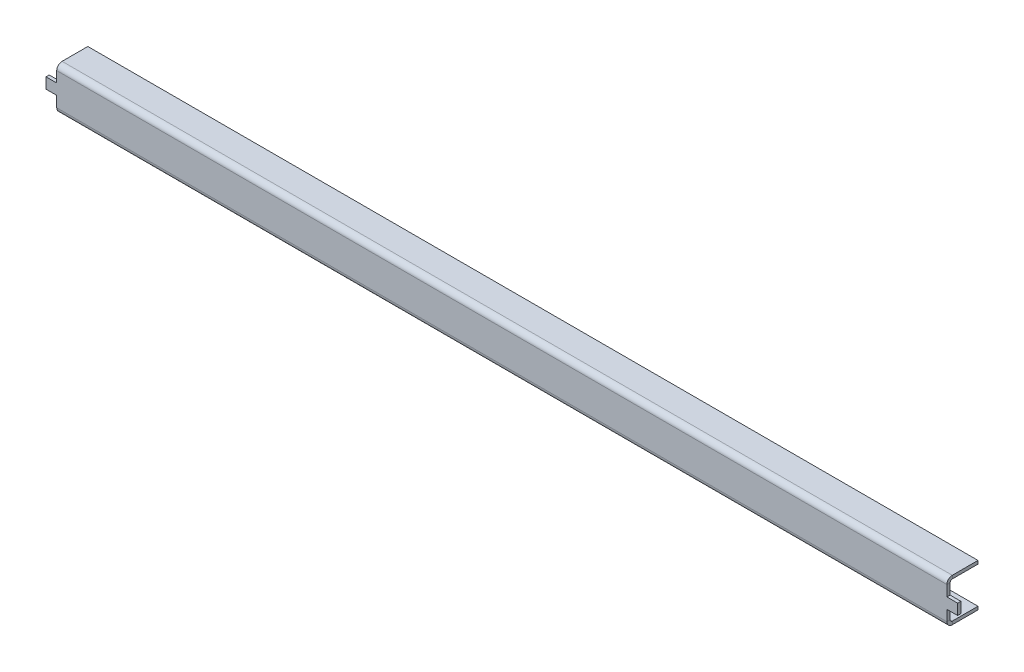
ISO-10303-21;
HEADER;
FILE_DESCRIPTION(('STEP AP214'),'2;1');
FILE_NAME('part.step','',(''),(''),'','','');
FILE_SCHEMA(('AUTOMOTIVE_DESIGN { 1 0 10303 214 1 1 1 1 }'));
ENDSEC;
DATA;
#1=APPLICATION_CONTEXT('core data for automotive mechanical design processes');
#2=APPLICATION_PROTOCOL_DEFINITION('international standard','automotive_design',2000,#1);
#3=PRODUCT_CONTEXT('',#1,'mechanical');
#4=PRODUCT('Part','Part','',(#3));
#5=PRODUCT_RELATED_PRODUCT_CATEGORY('part','',(#4));
#6=PRODUCT_DEFINITION_FORMATION('','',#4);
#7=PRODUCT_DEFINITION_CONTEXT('part definition',#1,'design');
#8=PRODUCT_DEFINITION('design','',#6,#7);
#9=PRODUCT_DEFINITION_SHAPE('','',#8);
#10=(LENGTH_UNIT() NAMED_UNIT(*) SI_UNIT(.MILLI.,.METRE.));
#11=(NAMED_UNIT(*) PLANE_ANGLE_UNIT() SI_UNIT($,.RADIAN.));
#12=(NAMED_UNIT(*) SI_UNIT($,.STERADIAN.) SOLID_ANGLE_UNIT());
#13=UNCERTAINTY_MEASURE_WITH_UNIT(LENGTH_MEASURE(1.E-05),#10,'distance_accuracy_value','');
#14=(GEOMETRIC_REPRESENTATION_CONTEXT(3) GLOBAL_UNCERTAINTY_ASSIGNED_CONTEXT((#13)) GLOBAL_UNIT_ASSIGNED_CONTEXT((#10,
#11,#12)) REPRESENTATION_CONTEXT('',''));
#15=CARTESIAN_POINT('',(0.,0.,0.));
#16=DIRECTION('',(0.,0.,1.));
#17=DIRECTION('',(1.,0.,0.));
#18=AXIS2_PLACEMENT_3D('',#15,#16,#17);
#19=CARTESIAN_POINT('',(207.5,487.846915451609,3.1641356201817E-12));
#20=DIRECTION('',(0.,0.,1.));
#21=DIRECTION('',(0.,-1.,0.));
#22=AXIS2_PLACEMENT_3D('',#19,#20,#21);
#23=PLANE('',#22);
#24=DIRECTION('',(0.,-1.,0.));
#25=VECTOR('',#24,1.);
#26=CARTESIAN_POINT('',(207.5,487.846915451609,3.1641356201817E-12));
#27=LINE('',#26,#25);
#28=CARTESIAN_POINT('',(207.5,-342.5,0.));
#29=VERTEX_POINT('',#28);
#30=CARTESIAN_POINT('',(207.5,-344.,0.));
#31=VERTEX_POINT('',#30);
#32=EDGE_CURVE('E286',#29,#31,#27,.T.);
#33=ORIENTED_EDGE('',*,*,#32,.T.);
#34=DIRECTION('',(1.,0.,0.));
#35=VECTOR('',#34,1.);
#36=CARTESIAN_POINT('',(207.5,-344.,0.));
#37=LINE('',#36,#35);
#38=CARTESIAN_POINT('',(-207.5,-344.,0.));
#39=VERTEX_POINT('',#38);
#40=EDGE_CURVE('E77',#31,#39,#37,.F.);
#41=ORIENTED_EDGE('',*,*,#40,.T.);
#42=DIRECTION('',(0.,-1.,0.));
#43=VECTOR('',#42,1.);
#44=CARTESIAN_POINT('',(-207.5,487.846915451609,3.1641356201817E-12));
#45=LINE('',#44,#43);
#46=CARTESIAN_POINT('',(-207.5,-342.5,0.));
#47=VERTEX_POINT('',#46);
#48=EDGE_CURVE('E499',#47,#39,#45,.T.);
#49=ORIENTED_EDGE('',*,*,#48,.F.);
#50=DIRECTION('',(1.,0.,0.));
#51=VECTOR('',#50,1.);
#52=CARTESIAN_POINT('',(207.5,-342.5,0.));
#53=LINE('',#52,#51);
#54=EDGE_CURVE('E12',#29,#47,#53,.F.);
#55=ORIENTED_EDGE('',*,*,#54,.F.);
#56=EDGE_LOOP('',(#33,#41,#49,#55));
#57=FACE_BOUND('',#56,.T.);
#58=ADVANCED_FACE('F53',(#57),#23,.F.);
#59=CARTESIAN_POINT('',(207.5,487.846915451609,12.0000000000032));
#60=DIRECTION('',(1.,0.,0.));
#61=DIRECTION('',(0.,1.,0.));
#62=AXIS2_PLACEMENT_3D('',#59,#60,#61);
#63=PLANE('',#62);
#64=DIRECTION('',(0.,0.,-1.));
#65=VECTOR('',#64,1.);
#66=CARTESIAN_POINT('',(207.5,-344.,12.));
#67=LINE('',#66,#65);
#68=CARTESIAN_POINT('',(207.5,-344.,11.9999999999999));
#69=VERTEX_POINT('',#68);
#70=EDGE_CURVE('E263',#69,#31,#67,.T.);
#71=ORIENTED_EDGE('',*,*,#70,.T.);
#72=ORIENTED_EDGE('',*,*,#32,.F.);
#73=DIRECTION('',(0.,0.,-1.));
#74=VECTOR('',#73,1.);
#75=CARTESIAN_POINT('',(207.5,-342.5,12.));
#76=LINE('',#75,#74);
#77=CARTESIAN_POINT('',(207.5,-342.5,12.));
#78=VERTEX_POINT('',#77);
#79=EDGE_CURVE('E111',#29,#78,#76,.F.);
#80=ORIENTED_EDGE('',*,*,#79,.T.);
#81=DIRECTION('',(0.,-1.,0.));
#82=VECTOR('',#81,1.);
#83=CARTESIAN_POINT('',(207.5,487.846915451609,12.0000000000032));
#84=LINE('',#83,#82);
#85=EDGE_CURVE('E261',#78,#69,#84,.T.);
#86=ORIENTED_EDGE('',*,*,#85,.T.);
#87=EDGE_LOOP('',(#71,#72,#80,#86));
#88=FACE_BOUND('',#87,.T.);
#89=ADVANCED_FACE('F262',(#88),#63,.T.);
#90=CARTESIAN_POINT('',(207.5,-344.,0.));
#91=DIRECTION('',(0.,1.,0.));
#92=DIRECTION('',(0.,0.,1.));
#93=AXIS2_PLACEMENT_3D('',#90,#91,#92);
#94=PLANE('',#93);
#95=DIRECTION('',(0.,0.,1.));
#96=VECTOR('',#95,1.);
#97=CARTESIAN_POINT('',(-207.5,-344.,12.));
#98=LINE('',#97,#96);
#99=CARTESIAN_POINT('',(-207.5,-344.,12.));
#100=VERTEX_POINT('',#99);
#101=EDGE_CURVE('E269',#39,#100,#98,.T.);
#102=ORIENTED_EDGE('',*,*,#101,.F.);
#103=ORIENTED_EDGE('',*,*,#40,.F.);
#104=ORIENTED_EDGE('',*,*,#70,.F.);
#105=DIRECTION('',(-1.,0.,0.));
#106=VECTOR('',#105,1.);
#107=CARTESIAN_POINT('',(207.5,-344.,12.));
#108=LINE('',#107,#106);
#109=EDGE_CURVE('E274',#100,#69,#108,.F.);
#110=ORIENTED_EDGE('',*,*,#109,.F.);
#111=EDGE_LOOP('',(#102,#103,#104,#110));
#112=FACE_BOUND('',#111,.T.);
#113=ADVANCED_FACE('F273',(#112),#94,.F.);
#114=CARTESIAN_POINT('',(-207.5,487.846915451609,12.0000000000032));
#115=DIRECTION('',(-1.,0.,0.));
#116=DIRECTION('',(0.,-1.,0.));
#117=AXIS2_PLACEMENT_3D('',#114,#115,#116);
#118=PLANE('',#117);
#119=ORIENTED_EDGE('',*,*,#101,.T.);
#120=DIRECTION('',(0.,-1.,0.));
#121=VECTOR('',#120,1.);
#122=CARTESIAN_POINT('',(-207.5,487.846915451609,12.0000000000032));
#123=LINE('',#122,#121);
#124=CARTESIAN_POINT('',(-207.5,-342.5,12.));
#125=VERTEX_POINT('',#124);
#126=EDGE_CURVE('E58',#125,#100,#123,.T.);
#127=ORIENTED_EDGE('',*,*,#126,.F.);
#128=DIRECTION('',(0.,0.,1.));
#129=VECTOR('',#128,1.);
#130=CARTESIAN_POINT('',(-207.5,-342.5,12.));
#131=LINE('',#130,#129);
#132=EDGE_CURVE('E482',#125,#47,#131,.F.);
#133=ORIENTED_EDGE('',*,*,#132,.T.);
#134=ORIENTED_EDGE('',*,*,#48,.T.);
#135=EDGE_LOOP('',(#119,#127,#133,#134));
#136=FACE_BOUND('',#135,.T.);
#137=ADVANCED_FACE('F592',(#136),#118,.T.);
#138=CARTESIAN_POINT('',(207.5,-342.5,0.));
#139=DIRECTION('',(0.,1.,0.));
#140=DIRECTION('',(0.,0.,1.));
#141=AXIS2_PLACEMENT_3D('',#138,#139,#140);
#142=PLANE('',#141);
#143=ORIENTED_EDGE('',*,*,#132,.F.);
#144=DIRECTION('',(-1.,0.,0.));
#145=VECTOR('',#144,1.);
#146=CARTESIAN_POINT('',(207.5,-342.5,12.));
#147=LINE('',#146,#145);
#148=EDGE_CURVE('E65',#125,#78,#147,.F.);
#149=ORIENTED_EDGE('',*,*,#148,.T.);
#150=ORIENTED_EDGE('',*,*,#79,.F.);
#151=ORIENTED_EDGE('',*,*,#54,.T.);
#152=EDGE_LOOP('',(#143,#149,#150,#151));
#153=FACE_BOUND('',#152,.T.);
#154=ADVANCED_FACE('F56',(#153),#142,.T.);
#155=CARTESIAN_POINT('',(207.5,-1155.84691545161,3.21964677141295E-12));
#156=DIRECTION('',(0.,0.,1.));
#157=DIRECTION('',(0.,-1.,0.));
#158=AXIS2_PLACEMENT_3D('',#155,#156,#157);
#159=PLANE('',#158);
#160=DIRECTION('',(0.,1.,0.));
#161=VECTOR('',#160,1.);
#162=CARTESIAN_POINT('',(-207.5,-1155.84691545161,3.21964677141295E-12));
#163=LINE('',#162,#161);
#164=CARTESIAN_POINT('',(-207.5,-325.5,0.));
#165=VERTEX_POINT('',#164);
#166=CARTESIAN_POINT('',(-207.5,-324.,0.));
#167=VERTEX_POINT('',#166);
#168=EDGE_CURVE('E474',#165,#167,#163,.T.);
#169=ORIENTED_EDGE('',*,*,#168,.T.);
#170=DIRECTION('',(1.,0.,0.));
#171=VECTOR('',#170,1.);
#172=CARTESIAN_POINT('',(207.5,-324.,0.));
#173=LINE('',#172,#171);
#174=CARTESIAN_POINT('',(207.5,-324.,0.));
#175=VERTEX_POINT('',#174);
#176=EDGE_CURVE('E469',#167,#175,#173,.T.);
#177=ORIENTED_EDGE('',*,*,#176,.T.);
#178=DIRECTION('',(0.,1.,0.));
#179=VECTOR('',#178,1.);
#180=CARTESIAN_POINT('',(207.5,-1155.84691545161,3.21964677141295E-12));
#181=LINE('',#180,#179);
#182=CARTESIAN_POINT('',(207.5,-325.5,0.));
#183=VERTEX_POINT('',#182);
#184=EDGE_CURVE('E448',#183,#175,#181,.T.);
#185=ORIENTED_EDGE('',*,*,#184,.F.);
#186=DIRECTION('',(1.,0.,0.));
#187=VECTOR('',#186,1.);
#188=CARTESIAN_POINT('',(207.5,-325.5,0.));
#189=LINE('',#188,#187);
#190=EDGE_CURVE('E443',#165,#183,#189,.T.);
#191=ORIENTED_EDGE('',*,*,#190,.F.);
#192=EDGE_LOOP('',(#169,#177,#185,#191));
#193=FACE_BOUND('',#192,.T.);
#194=ADVANCED_FACE('F516',(#193),#159,.F.);
#195=CARTESIAN_POINT('',(-207.5,-1155.84691545161,12.0000000000032));
#196=DIRECTION('',(-1.,0.,0.));
#197=DIRECTION('',(0.,1.,0.));
#198=AXIS2_PLACEMENT_3D('',#195,#196,#197);
#199=PLANE('',#198);
#200=DIRECTION('',(0.,0.,1.));
#201=VECTOR('',#200,1.);
#202=CARTESIAN_POINT('',(-207.5,-324.,12.));
#203=LINE('',#202,#201);
#204=CARTESIAN_POINT('',(-207.5,-324.,12.));
#205=VERTEX_POINT('',#204);
#206=EDGE_CURVE('E465',#205,#167,#203,.F.);
#207=ORIENTED_EDGE('',*,*,#206,.T.);
#208=ORIENTED_EDGE('',*,*,#168,.F.);
#209=DIRECTION('',(0.,0.,1.));
#210=VECTOR('',#209,1.);
#211=CARTESIAN_POINT('',(-207.5,-325.5,12.));
#212=LINE('',#211,#210);
#213=CARTESIAN_POINT('',(-207.5,-325.5,12.0000000000001));
#214=VERTEX_POINT('',#213);
#215=EDGE_CURVE('E153',#165,#214,#212,.T.);
#216=ORIENTED_EDGE('',*,*,#215,.T.);
#217=DIRECTION('',(0.,1.,0.));
#218=VECTOR('',#217,1.);
#219=CARTESIAN_POINT('',(-207.5,-1155.84691545161,12.0000000000033));
#220=LINE('',#219,#218);
#221=EDGE_CURVE('E460',#214,#205,#220,.T.);
#222=ORIENTED_EDGE('',*,*,#221,.T.);
#223=EDGE_LOOP('',(#207,#208,#216,#222));
#224=FACE_BOUND('',#223,.T.);
#225=ADVANCED_FACE('F517',(#224),#199,.T.);
#226=CARTESIAN_POINT('',(207.5,-324.,14.5000000000001));
#227=DIRECTION('',(0.,-1.,0.));
#228=DIRECTION('',(0.,0.,-1.));
#229=AXIS2_PLACEMENT_3D('',#226,#227,#228);
#230=PLANE('',#229);
#231=ORIENTED_EDGE('',*,*,#206,.F.);
#232=DIRECTION('',(-1.,0.,0.));
#233=VECTOR('',#232,1.);
#234=CARTESIAN_POINT('',(207.5,-324.,12.0000000000001));
#235=LINE('',#234,#233);
#236=CARTESIAN_POINT('',(207.5,-324.,12.0000000000001));
#237=VERTEX_POINT('',#236);
#238=EDGE_CURVE('E504',#237,#205,#235,.T.);
#239=ORIENTED_EDGE('',*,*,#238,.F.);
#240=DIRECTION('',(0.,0.,-1.));
#241=VECTOR('',#240,1.);
#242=CARTESIAN_POINT('',(207.5,-324.,12.0000000000001));
#243=LINE('',#242,#241);
#244=EDGE_CURVE('E457',#175,#237,#243,.F.);
#245=ORIENTED_EDGE('',*,*,#244,.F.);
#246=ORIENTED_EDGE('',*,*,#176,.F.);
#247=EDGE_LOOP('',(#231,#239,#245,#246));
#248=FACE_BOUND('',#247,.T.);
#249=ADVANCED_FACE('F612',(#248),#230,.F.);
#250=CARTESIAN_POINT('',(207.5,-1155.84691545161,12.0000000000032));
#251=DIRECTION('',(1.,0.,0.));
#252=DIRECTION('',(0.,-1.,0.));
#253=AXIS2_PLACEMENT_3D('',#250,#251,#252);
#254=PLANE('',#253);
#255=ORIENTED_EDGE('',*,*,#244,.T.);
#256=DIRECTION('',(0.,1.,0.));
#257=VECTOR('',#256,1.);
#258=CARTESIAN_POINT('',(207.5,-1155.84691545161,12.0000000000033));
#259=LINE('',#258,#257);
#260=CARTESIAN_POINT('',(207.5,-325.5,12.0000000000001));
#261=VERTEX_POINT('',#260);
#262=EDGE_CURVE('E146',#261,#237,#259,.T.);
#263=ORIENTED_EDGE('',*,*,#262,.F.);
#264=DIRECTION('',(0.,0.,-1.));
#265=VECTOR('',#264,1.);
#266=CARTESIAN_POINT('',(207.5,-325.5,12.));
#267=LINE('',#266,#265);
#268=EDGE_CURVE('E120',#261,#183,#267,.T.);
#269=ORIENTED_EDGE('',*,*,#268,.T.);
#270=ORIENTED_EDGE('',*,*,#184,.T.);
#271=EDGE_LOOP('',(#255,#263,#269,#270));
#272=FACE_BOUND('',#271,.T.);
#273=ADVANCED_FACE('F696',(#272),#254,.T.);
#274=CARTESIAN_POINT('',(207.5,-325.5,14.5000000000001));
#275=DIRECTION('',(0.,-1.,0.));
#276=DIRECTION('',(0.,0.,-1.));
#277=AXIS2_PLACEMENT_3D('',#274,#275,#276);
#278=PLANE('',#277);
#279=ORIENTED_EDGE('',*,*,#215,.F.);
#280=ORIENTED_EDGE('',*,*,#190,.T.);
#281=ORIENTED_EDGE('',*,*,#268,.F.);
#282=DIRECTION('',(-1.,0.,0.));
#283=VECTOR('',#282,1.);
#284=CARTESIAN_POINT('',(207.5,-325.5,12.0000000000001));
#285=LINE('',#284,#283);
#286=EDGE_CURVE('E439',#261,#214,#285,.T.);
#287=ORIENTED_EDGE('',*,*,#286,.T.);
#288=EDGE_LOOP('',(#279,#280,#281,#287));
#289=FACE_BOUND('',#288,.T.);
#290=ADVANCED_FACE('F520',(#289),#278,.T.);
#291=CARTESIAN_POINT('',(207.5,-344.,14.5));
#292=DIRECTION('',(0.,0.,-1.));
#293=DIRECTION('',(0.,1.,0.));
#294=AXIS2_PLACEMENT_3D('',#291,#292,#293);
#295=PLANE('',#294);
#296=DIRECTION('',(0.,1.,0.));
#297=VECTOR('',#296,1.);
#298=CARTESIAN_POINT('',(-207.5,-342.5,14.5));
#299=LINE('',#298,#297);
#300=CARTESIAN_POINT('',(-207.5,-341.5,14.5));
#301=VERTEX_POINT('',#300);
#302=CARTESIAN_POINT('',(-207.5,-336.5,14.5000000000003));
#303=VERTEX_POINT('',#302);
#304=EDGE_CURVE('E322',#301,#303,#299,.T.);
#305=ORIENTED_EDGE('',*,*,#304,.F.);
#306=DIRECTION('',(1.,0.,0.));
#307=VECTOR('',#306,1.);
#308=CARTESIAN_POINT('',(207.5,-341.5,14.5));
#309=LINE('',#308,#307);
#310=CARTESIAN_POINT('',(207.5,-341.5,14.5));
#311=VERTEX_POINT('',#310);
#312=EDGE_CURVE('E327',#311,#301,#309,.F.);
#313=ORIENTED_EDGE('',*,*,#312,.F.);
#314=DIRECTION('',(0.,1.,0.));
#315=VECTOR('',#314,1.);
#316=CARTESIAN_POINT('',(207.5,-325.5,14.5));
#317=LINE('',#316,#315);
#318=CARTESIAN_POINT('',(207.5,-336.5,14.5));
#319=VERTEX_POINT('',#318);
#320=EDGE_CURVE('E570',#319,#311,#317,.F.);
#321=ORIENTED_EDGE('',*,*,#320,.F.);
#322=DIRECTION('',(1.,0.,0.));
#323=VECTOR('',#322,1.);
#324=CARTESIAN_POINT('',(207.5,-336.5,14.5000000000003));
#325=LINE('',#324,#323);
#326=CARTESIAN_POINT('',(212.5,-336.5,14.5000000000003));
#327=VERTEX_POINT('',#326);
#328=EDGE_CURVE('E578',#319,#327,#325,.T.);
#329=ORIENTED_EDGE('',*,*,#328,.T.);
#330=DIRECTION('',(0.,1.,0.));
#331=VECTOR('',#330,1.);
#332=CARTESIAN_POINT('',(212.5,-336.5,14.5000000000003));
#333=LINE('',#332,#331);
#334=CARTESIAN_POINT('',(212.5,-331.5,14.5000000000003));
#335=VERTEX_POINT('',#334);
#336=EDGE_CURVE('E574',#327,#335,#333,.T.);
#337=ORIENTED_EDGE('',*,*,#336,.T.);
#338=DIRECTION('',(-1.,0.,0.));
#339=VECTOR('',#338,1.);
#340=CARTESIAN_POINT('',(207.5,-331.5,14.5000000000003));
#341=LINE('',#340,#339);
#342=CARTESIAN_POINT('',(207.5,-331.5,14.5000000000003));
#343=VERTEX_POINT('',#342);
#344=EDGE_CURVE('E569',#335,#343,#341,.T.);
#345=ORIENTED_EDGE('',*,*,#344,.T.);
#346=CARTESIAN_POINT('',(207.5,-326.5,14.5));
#347=VERTEX_POINT('',#346);
#348=EDGE_CURVE('E565',#347,#343,#317,.F.);
#349=ORIENTED_EDGE('',*,*,#348,.F.);
#350=DIRECTION('',(-1.,0.,0.));
#351=VECTOR('',#350,1.);
#352=CARTESIAN_POINT('',(207.5,-326.5,14.5));
#353=LINE('',#352,#351);
#354=CARTESIAN_POINT('',(-207.5,-326.5,14.5));
#355=VERTEX_POINT('',#354);
#356=EDGE_CURVE('E348',#355,#347,#353,.F.);
#357=ORIENTED_EDGE('',*,*,#356,.F.);
#358=CARTESIAN_POINT('',(-207.5,-331.5,14.5));
#359=VERTEX_POINT('',#358);
#360=EDGE_CURVE('E328',#359,#355,#299,.T.);
#361=ORIENTED_EDGE('',*,*,#360,.F.);
#362=DIRECTION('',(-1.,0.,0.));
#363=VECTOR('',#362,1.);
#364=CARTESIAN_POINT('',(-207.5,-331.5,14.5000000000003));
#365=LINE('',#364,#363);
#366=CARTESIAN_POINT('',(-212.5,-331.5,14.5000000000003));
#367=VERTEX_POINT('',#366);
#368=EDGE_CURVE('E343',#359,#367,#365,.T.);
#369=ORIENTED_EDGE('',*,*,#368,.T.);
#370=DIRECTION('',(0.,-1.,0.));
#371=VECTOR('',#370,1.);
#372=CARTESIAN_POINT('',(-212.5,-331.5,14.5000000000003));
#373=LINE('',#372,#371);
#374=CARTESIAN_POINT('',(-212.5,-336.5,14.5000000000003));
#375=VERTEX_POINT('',#374);
#376=EDGE_CURVE('E347',#367,#375,#373,.T.);
#377=ORIENTED_EDGE('',*,*,#376,.T.);
#378=DIRECTION('',(1.,0.,0.));
#379=VECTOR('',#378,1.);
#380=CARTESIAN_POINT('',(-207.5,-336.5,14.5000000000003));
#381=LINE('',#380,#379);
#382=EDGE_CURVE('E352',#375,#303,#381,.T.);
#383=ORIENTED_EDGE('',*,*,#382,.T.);
#384=EDGE_LOOP('',(#305,#313,#321,#329,#337,#345,#349,#357,#361,#369,#377,#383));
#385=FACE_BOUND('',#384,.T.);
#386=ADVANCED_FACE('F560',(#385),#295,.F.);
#387=CARTESIAN_POINT('',(-207.5,-343.999999999999,-837.529246998597));
#388=DIRECTION('',(1.,0.,0.));
#389=DIRECTION('',(0.,0.,-1.));
#390=AXIS2_PLACEMENT_3D('',#387,#388,#389);
#391=PLANE('',#390);
#392=DIRECTION('',(0.,0.,1.));
#393=VECTOR('',#392,1.);
#394=CARTESIAN_POINT('',(-207.5,-341.499999999999,-837.529246998597));
#395=LINE('',#394,#393);
#396=CARTESIAN_POINT('',(-207.5,-341.5,13.));
#397=VERTEX_POINT('',#396);
#398=EDGE_CURVE('E397',#397,#301,#395,.T.);
#399=ORIENTED_EDGE('',*,*,#398,.T.);
#400=ORIENTED_EDGE('',*,*,#304,.T.);
#401=DIRECTION('',(0.,0.,1.));
#402=VECTOR('',#401,1.);
#403=CARTESIAN_POINT('',(-207.5,-336.499999999999,-837.529246998597));
#404=LINE('',#403,#402);
#405=CARTESIAN_POINT('',(-207.5,-336.5,13.));
#406=VERTEX_POINT('',#405);
#407=EDGE_CURVE('E437',#406,#303,#404,.T.);
#408=ORIENTED_EDGE('',*,*,#407,.F.);
#409=DIRECTION('',(0.,1.,0.));
#410=VECTOR('',#409,1.);
#411=CARTESIAN_POINT('',(-207.5,-344.,13.));
#412=LINE('',#411,#410);
#413=EDGE_CURVE('E356',#397,#406,#412,.T.);
#414=ORIENTED_EDGE('',*,*,#413,.F.);
#415=EDGE_LOOP('',(#399,#400,#408,#414));
#416=FACE_BOUND('',#415,.T.);
#417=ADVANCED_FACE('F550',(#416),#391,.F.);
#418=CARTESIAN_POINT('',(-207.5,-336.499999999999,-837.529246998597));
#419=DIRECTION('',(0.,-1.,0.));
#420=DIRECTION('',(0.,0.,-1.));
#421=AXIS2_PLACEMENT_3D('',#418,#419,#420);
#422=PLANE('',#421);
#423=ORIENTED_EDGE('',*,*,#382,.F.);
#424=DIRECTION('',(0.,0.,1.));
#425=VECTOR('',#424,1.);
#426=CARTESIAN_POINT('',(-212.5,-336.499999999999,-837.529246998597));
#427=LINE('',#426,#425);
#428=CARTESIAN_POINT('',(-212.5,-336.5,13.));
#429=VERTEX_POINT('',#428);
#430=EDGE_CURVE('E434',#429,#375,#427,.T.);
#431=ORIENTED_EDGE('',*,*,#430,.F.);
#432=DIRECTION('',(1.,0.,0.));
#433=VECTOR('',#432,1.);
#434=CARTESIAN_POINT('',(-207.5,-336.5,13.0000000000003));
#435=LINE('',#434,#433);
#436=EDGE_CURVE('E161',#429,#406,#435,.T.);
#437=ORIENTED_EDGE('',*,*,#436,.T.);
#438=ORIENTED_EDGE('',*,*,#407,.T.);
#439=EDGE_LOOP('',(#423,#431,#437,#438));
#440=FACE_BOUND('',#439,.T.);
#441=ADVANCED_FACE('F553',(#440),#422,.T.);
#442=CARTESIAN_POINT('',(-212.5,-331.499999999999,-837.529246998597));
#443=DIRECTION('',(-1.,0.,0.));
#444=DIRECTION('',(0.,0.,1.));
#445=AXIS2_PLACEMENT_3D('',#442,#443,#444);
#446=PLANE('',#445);
#447=ORIENTED_EDGE('',*,*,#376,.F.);
#448=DIRECTION('',(0.,0.,1.));
#449=VECTOR('',#448,1.);
#450=CARTESIAN_POINT('',(-212.5,-331.499999999999,-837.529246998597));
#451=LINE('',#450,#449);
#452=CARTESIAN_POINT('',(-212.5,-331.5,13.));
#453=VERTEX_POINT('',#452);
#454=EDGE_CURVE('E430',#453,#367,#451,.T.);
#455=ORIENTED_EDGE('',*,*,#454,.F.);
#456=DIRECTION('',(0.,-1.,0.));
#457=VECTOR('',#456,1.);
#458=CARTESIAN_POINT('',(-212.5,-331.5,13.0000000000003));
#459=LINE('',#458,#457);
#460=EDGE_CURVE('E169',#453,#429,#459,.T.);
#461=ORIENTED_EDGE('',*,*,#460,.T.);
#462=ORIENTED_EDGE('',*,*,#430,.T.);
#463=EDGE_LOOP('',(#447,#455,#461,#462));
#464=FACE_BOUND('',#463,.T.);
#465=ADVANCED_FACE('F556',(#464),#446,.T.);
#466=CARTESIAN_POINT('',(-207.5,-331.499999999999,-837.529246998597));
#467=DIRECTION('',(0.,1.,0.));
#468=DIRECTION('',(0.,0.,1.));
#469=AXIS2_PLACEMENT_3D('',#466,#467,#468);
#470=PLANE('',#469);
#471=ORIENTED_EDGE('',*,*,#368,.F.);
#472=DIRECTION('',(0.,0.,1.));
#473=VECTOR('',#472,1.);
#474=CARTESIAN_POINT('',(-207.5,-331.499999999999,-837.529246998597));
#475=LINE('',#474,#473);
#476=CARTESIAN_POINT('',(-207.5,-331.5,13.));
#477=VERTEX_POINT('',#476);
#478=EDGE_CURVE('E426',#477,#359,#475,.T.);
#479=ORIENTED_EDGE('',*,*,#478,.F.);
#480=DIRECTION('',(-1.,0.,0.));
#481=VECTOR('',#480,1.);
#482=CARTESIAN_POINT('',(-207.5,-331.5,13.0000000000003));
#483=LINE('',#482,#481);
#484=EDGE_CURVE('E369',#477,#453,#483,.T.);
#485=ORIENTED_EDGE('',*,*,#484,.T.);
#486=ORIENTED_EDGE('',*,*,#454,.T.);
#487=EDGE_LOOP('',(#471,#479,#485,#486));
#488=FACE_BOUND('',#487,.T.);
#489=ADVANCED_FACE('F559',(#488),#470,.T.);
#490=ORIENTED_EDGE('',*,*,#478,.T.);
#491=ORIENTED_EDGE('',*,*,#360,.T.);
#492=DIRECTION('',(0.,0.,1.));
#493=VECTOR('',#492,1.);
#494=CARTESIAN_POINT('',(-207.5,-326.499999999999,-837.529246998597));
#495=LINE('',#494,#493);
#496=CARTESIAN_POINT('',(-207.5,-326.5,13.));
#497=VERTEX_POINT('',#496);
#498=EDGE_CURVE('E423',#497,#355,#495,.T.);
#499=ORIENTED_EDGE('',*,*,#498,.F.);
#500=EDGE_CURVE('E373',#477,#497,#412,.T.);
#501=ORIENTED_EDGE('',*,*,#500,.F.);
#502=EDGE_LOOP('',(#490,#491,#499,#501));
#503=FACE_BOUND('',#502,.T.);
#504=ADVANCED_FACE('F539',(#503),#391,.F.);
#505=CARTESIAN_POINT('',(207.5,-343.999999999999,-837.529246998597));
#506=DIRECTION('',(-1.,0.,0.));
#507=DIRECTION('',(0.,0.,1.));
#508=AXIS2_PLACEMENT_3D('',#505,#506,#507);
#509=PLANE('',#508);
#510=DIRECTION('',(0.,0.,1.));
#511=VECTOR('',#510,1.);
#512=CARTESIAN_POINT('',(207.5,-326.499999999999,-837.529246998597));
#513=LINE('',#512,#511);
#514=CARTESIAN_POINT('',(207.5,-326.5,13.));
#515=VERTEX_POINT('',#514);
#516=EDGE_CURVE('E419',#515,#347,#513,.T.);
#517=ORIENTED_EDGE('',*,*,#516,.T.);
#518=ORIENTED_EDGE('',*,*,#348,.T.);
#519=DIRECTION('',(0.,0.,1.));
#520=VECTOR('',#519,1.);
#521=CARTESIAN_POINT('',(207.5,-331.499999999999,-837.529246998597));
#522=LINE('',#521,#520);
#523=CARTESIAN_POINT('',(207.5,-331.5,13.));
#524=VERTEX_POINT('',#523);
#525=EDGE_CURVE('E415',#524,#343,#522,.T.);
#526=ORIENTED_EDGE('',*,*,#525,.F.);
#527=DIRECTION('',(0.,1.,0.));
#528=VECTOR('',#527,1.);
#529=CARTESIAN_POINT('',(207.5,-344.,13.));
#530=LINE('',#529,#528);
#531=EDGE_CURVE('E385',#515,#524,#530,.F.);
#532=ORIENTED_EDGE('',*,*,#531,.F.);
#533=EDGE_LOOP('',(#517,#518,#526,#532));
#534=FACE_BOUND('',#533,.T.);
#535=ADVANCED_FACE('F656',(#534),#509,.F.);
#536=CARTESIAN_POINT('',(207.5,-331.499999999999,-837.529246998597));
#537=DIRECTION('',(0.,1.,0.));
#538=DIRECTION('',(0.,0.,1.));
#539=AXIS2_PLACEMENT_3D('',#536,#537,#538);
#540=PLANE('',#539);
#541=ORIENTED_EDGE('',*,*,#344,.F.);
#542=DIRECTION('',(0.,0.,1.));
#543=VECTOR('',#542,1.);
#544=CARTESIAN_POINT('',(212.5,-331.499999999999,-837.529246998597));
#545=LINE('',#544,#543);
#546=CARTESIAN_POINT('',(212.5,-331.5,13.));
#547=VERTEX_POINT('',#546);
#548=EDGE_CURVE('E411',#547,#335,#545,.T.);
#549=ORIENTED_EDGE('',*,*,#548,.F.);
#550=DIRECTION('',(-1.,0.,0.));
#551=VECTOR('',#550,1.);
#552=CARTESIAN_POINT('',(207.5,-331.5,13.0000000000003));
#553=LINE('',#552,#551);
#554=EDGE_CURVE('E381',#547,#524,#553,.T.);
#555=ORIENTED_EDGE('',*,*,#554,.T.);
#556=ORIENTED_EDGE('',*,*,#525,.T.);
#557=EDGE_LOOP('',(#541,#549,#555,#556));
#558=FACE_BOUND('',#557,.T.);
#559=ADVANCED_FACE('F659',(#558),#540,.T.);
#560=CARTESIAN_POINT('',(212.5,-336.499999999999,-837.529246998597));
#561=DIRECTION('',(1.,0.,0.));
#562=DIRECTION('',(0.,0.,-1.));
#563=AXIS2_PLACEMENT_3D('',#560,#561,#562);
#564=PLANE('',#563);
#565=ORIENTED_EDGE('',*,*,#336,.F.);
#566=DIRECTION('',(0.,0.,1.));
#567=VECTOR('',#566,1.);
#568=CARTESIAN_POINT('',(212.5,-336.499999999999,-837.529246998597));
#569=LINE('',#568,#567);
#570=CARTESIAN_POINT('',(212.5,-336.5,13.));
#571=VERTEX_POINT('',#570);
#572=EDGE_CURVE('E407',#571,#327,#569,.T.);
#573=ORIENTED_EDGE('',*,*,#572,.F.);
#574=DIRECTION('',(0.,1.,0.));
#575=VECTOR('',#574,1.);
#576=CARTESIAN_POINT('',(212.5,-336.5,13.0000000000003));
#577=LINE('',#576,#575);
#578=EDGE_CURVE('E384',#571,#547,#577,.T.);
#579=ORIENTED_EDGE('',*,*,#578,.T.);
#580=ORIENTED_EDGE('',*,*,#548,.T.);
#581=EDGE_LOOP('',(#565,#573,#579,#580));
#582=FACE_BOUND('',#581,.T.);
#583=ADVANCED_FACE('F663',(#582),#564,.T.);
#584=CARTESIAN_POINT('',(207.5,-336.499999999999,-837.529246998597));
#585=DIRECTION('',(0.,-1.,0.));
#586=DIRECTION('',(0.,0.,-1.));
#587=AXIS2_PLACEMENT_3D('',#584,#585,#586);
#588=PLANE('',#587);
#589=ORIENTED_EDGE('',*,*,#328,.F.);
#590=DIRECTION('',(0.,0.,1.));
#591=VECTOR('',#590,1.);
#592=CARTESIAN_POINT('',(207.5,-336.499999999999,-837.529246998597));
#593=LINE('',#592,#591);
#594=CARTESIAN_POINT('',(207.5,-336.5,13.));
#595=VERTEX_POINT('',#594);
#596=EDGE_CURVE('E403',#595,#319,#593,.T.);
#597=ORIENTED_EDGE('',*,*,#596,.F.);
#598=DIRECTION('',(1.,0.,0.));
#599=VECTOR('',#598,1.);
#600=CARTESIAN_POINT('',(207.5,-336.5,13.0000000000003));
#601=LINE('',#600,#599);
#602=EDGE_CURVE('E388',#595,#571,#601,.T.);
#603=ORIENTED_EDGE('',*,*,#602,.T.);
#604=ORIENTED_EDGE('',*,*,#572,.T.);
#605=EDGE_LOOP('',(#589,#597,#603,#604));
#606=FACE_BOUND('',#605,.T.);
#607=ADVANCED_FACE('F667',(#606),#588,.T.);
#608=ORIENTED_EDGE('',*,*,#596,.T.);
#609=ORIENTED_EDGE('',*,*,#320,.T.);
#610=DIRECTION('',(0.,0.,1.));
#611=VECTOR('',#610,1.);
#612=CARTESIAN_POINT('',(207.5,-341.499999999999,-837.529246998597));
#613=LINE('',#612,#611);
#614=CARTESIAN_POINT('',(207.5,-341.5,13.));
#615=VERTEX_POINT('',#614);
#616=EDGE_CURVE('E289',#615,#311,#613,.T.);
#617=ORIENTED_EDGE('',*,*,#616,.F.);
#618=EDGE_CURVE('E392',#595,#615,#530,.F.);
#619=ORIENTED_EDGE('',*,*,#618,.F.);
#620=EDGE_LOOP('',(#608,#609,#617,#619));
#621=FACE_BOUND('',#620,.T.);
#622=ADVANCED_FACE('F649',(#621),#509,.F.);
#623=CARTESIAN_POINT('',(207.5,-344.,13.));
#624=DIRECTION('',(0.,0.,-1.));
#625=DIRECTION('',(0.,1.,0.));
#626=AXIS2_PLACEMENT_3D('',#623,#624,#625);
#627=PLANE('',#626);
#628=ORIENTED_EDGE('',*,*,#413,.T.);
#629=ORIENTED_EDGE('',*,*,#436,.F.);
#630=ORIENTED_EDGE('',*,*,#460,.F.);
#631=ORIENTED_EDGE('',*,*,#484,.F.);
#632=ORIENTED_EDGE('',*,*,#500,.T.);
#633=DIRECTION('',(1.,0.,0.));
#634=VECTOR('',#633,1.);
#635=CARTESIAN_POINT('',(207.5,-326.5,13.));
#636=LINE('',#635,#634);
#637=EDGE_CURVE('E374',#497,#515,#636,.T.);
#638=ORIENTED_EDGE('',*,*,#637,.T.);
#639=ORIENTED_EDGE('',*,*,#531,.T.);
#640=ORIENTED_EDGE('',*,*,#554,.F.);
#641=ORIENTED_EDGE('',*,*,#578,.F.);
#642=ORIENTED_EDGE('',*,*,#602,.F.);
#643=ORIENTED_EDGE('',*,*,#618,.T.);
#644=DIRECTION('',(1.,0.,0.));
#645=VECTOR('',#644,1.);
#646=CARTESIAN_POINT('',(207.5,-341.5,13.));
#647=LINE('',#646,#645);
#648=EDGE_CURVE('E393',#615,#397,#647,.F.);
#649=ORIENTED_EDGE('',*,*,#648,.T.);
#650=EDGE_LOOP('',(#628,#629,#630,#631,#632,#638,#639,#640,#641,#642,#643,#649));
#651=FACE_BOUND('',#650,.T.);
#652=ADVANCED_FACE('F543',(#651),#627,.T.);
#653=CARTESIAN_POINT('',(207.5,-326.5,12.0000000000001));
#654=DIRECTION('',(1.,0.,0.));
#655=DIRECTION('',(0.,0.,-1.));
#656=AXIS2_PLACEMENT_3D('',#653,#654,#655);
#657=PLANE('',#656);
#658=ORIENTED_EDGE('',*,*,#516,.F.);
#659=CARTESIAN_POINT('',(207.5,-326.5,12.0000000000001));
#660=DIRECTION('',(1.,0.,0.));
#661=DIRECTION('',(0.,0.,-1.));
#662=AXIS2_PLACEMENT_3D('',#659,#660,#661);
#663=CIRCLE('',#662,0.999999999999974);
#664=EDGE_CURVE('E315',#515,#261,#663,.F.);
#665=ORIENTED_EDGE('',*,*,#664,.T.);
#666=ORIENTED_EDGE('',*,*,#262,.T.);
#667=CARTESIAN_POINT('',(207.5,-326.5,12.0000000000001));
#668=DIRECTION('',(1.,0.,0.));
#669=DIRECTION('',(0.,0.,-1.));
#670=AXIS2_PLACEMENT_3D('',#667,#668,#669);
#671=CIRCLE('',#670,2.49999999999997);
#672=EDGE_CURVE('E316',#347,#237,#671,.F.);
#673=ORIENTED_EDGE('',*,*,#672,.F.);
#674=EDGE_LOOP('',(#658,#665,#666,#673));
#675=FACE_BOUND('',#674,.T.);
#676=ADVANCED_FACE('F631',(#675),#657,.T.);
#677=CARTESIAN_POINT('',(-207.5,-326.5,12.0000000000001));
#678=DIRECTION('',(-1.,0.,0.));
#679=DIRECTION('',(0.,0.,1.));
#680=AXIS2_PLACEMENT_3D('',#677,#678,#679);
#681=PLANE('',#680);
#682=ORIENTED_EDGE('',*,*,#221,.F.);
#683=CARTESIAN_POINT('',(-207.5,-326.5,12.0000000000001));
#684=DIRECTION('',(1.,0.,0.));
#685=DIRECTION('',(0.,0.,-1.));
#686=AXIS2_PLACEMENT_3D('',#683,#684,#685);
#687=CIRCLE('',#686,0.999999999999974);
#688=EDGE_CURVE('E295',#214,#497,#687,.T.);
#689=ORIENTED_EDGE('',*,*,#688,.T.);
#690=ORIENTED_EDGE('',*,*,#498,.T.);
#691=CARTESIAN_POINT('',(-207.5,-326.5,12.0000000000001));
#692=DIRECTION('',(1.,0.,0.));
#693=DIRECTION('',(0.,0.,-1.));
#694=AXIS2_PLACEMENT_3D('',#691,#692,#693);
#695=CIRCLE('',#694,2.49999999999997);
#696=EDGE_CURVE('E321',#205,#355,#695,.T.);
#697=ORIENTED_EDGE('',*,*,#696,.F.);
#698=EDGE_LOOP('',(#682,#689,#690,#697));
#699=FACE_BOUND('',#698,.T.);
#700=ADVANCED_FACE('F527',(#699),#681,.T.);
#701=CARTESIAN_POINT('',(-634.774209378474,-326.5,12.0000000000001));
#702=DIRECTION('',(1.,0.,0.));
#703=DIRECTION('',(0.,0.,-1.));
#704=AXIS2_PLACEMENT_3D('',#701,#702,#703);
#705=CYLINDRICAL_SURFACE('',#704,2.49999999999997);
#706=ORIENTED_EDGE('',*,*,#696,.T.);
#707=ORIENTED_EDGE('',*,*,#356,.T.);
#708=ORIENTED_EDGE('',*,*,#672,.T.);
#709=ORIENTED_EDGE('',*,*,#238,.T.);
#710=EDGE_LOOP('',(#706,#707,#708,#709));
#711=FACE_BOUND('',#710,.T.);
#712=ADVANCED_FACE('F636',(#711),#705,.T.);
#713=CARTESIAN_POINT('',(-634.774209378474,-326.5,12.0000000000001));
#714=DIRECTION('',(1.,0.,0.));
#715=DIRECTION('',(0.,0.,-1.));
#716=AXIS2_PLACEMENT_3D('',#713,#714,#715);
#717=CYLINDRICAL_SURFACE('',#716,0.999999999999974);
#718=ORIENTED_EDGE('',*,*,#688,.F.);
#719=ORIENTED_EDGE('',*,*,#286,.F.);
#720=ORIENTED_EDGE('',*,*,#664,.F.);
#721=ORIENTED_EDGE('',*,*,#637,.F.);
#722=EDGE_LOOP('',(#718,#719,#720,#721));
#723=FACE_BOUND('',#722,.T.);
#724=ADVANCED_FACE('F529',(#723),#717,.F.);
#725=CARTESIAN_POINT('',(-207.5,-341.5,12.));
#726=DIRECTION('',(-1.,0.,0.));
#727=DIRECTION('',(0.,0.,1.));
#728=AXIS2_PLACEMENT_3D('',#725,#726,#727);
#729=PLANE('',#728);
#730=ORIENTED_EDGE('',*,*,#398,.F.);
#731=CARTESIAN_POINT('',(-207.5,-341.5,12.));
#732=DIRECTION('',(-1.,0.,0.));
#733=DIRECTION('',(0.,0.,1.));
#734=AXIS2_PLACEMENT_3D('',#731,#732,#733);
#735=CIRCLE('',#734,0.999999999999973);
#736=EDGE_CURVE('E291',#397,#125,#735,.F.);
#737=ORIENTED_EDGE('',*,*,#736,.T.);
#738=ORIENTED_EDGE('',*,*,#126,.T.);
#739=CARTESIAN_POINT('',(-207.5,-341.5,12.));
#740=DIRECTION('',(-1.,0.,0.));
#741=DIRECTION('',(0.,0.,1.));
#742=AXIS2_PLACEMENT_3D('',#739,#740,#741);
#743=CIRCLE('',#742,2.49999999999997);
#744=EDGE_CURVE('E284',#301,#100,#743,.F.);
#745=ORIENTED_EDGE('',*,*,#744,.F.);
#746=EDGE_LOOP('',(#730,#737,#738,#745));
#747=FACE_BOUND('',#746,.T.);
#748=ADVANCED_FACE('F584',(#747),#729,.T.);
#749=CARTESIAN_POINT('',(207.5,-341.5,12.));
#750=DIRECTION('',(1.,0.,0.));
#751=DIRECTION('',(0.,0.,-1.));
#752=AXIS2_PLACEMENT_3D('',#749,#750,#751);
#753=PLANE('',#752);
#754=ORIENTED_EDGE('',*,*,#85,.F.);
#755=CARTESIAN_POINT('',(207.5,-341.5,12.));
#756=DIRECTION('',(-1.,0.,0.));
#757=DIRECTION('',(0.,0.,1.));
#758=AXIS2_PLACEMENT_3D('',#755,#756,#757);
#759=CIRCLE('',#758,0.999999999999973);
#760=EDGE_CURVE('E298',#78,#615,#759,.T.);
#761=ORIENTED_EDGE('',*,*,#760,.T.);
#762=ORIENTED_EDGE('',*,*,#616,.T.);
#763=CARTESIAN_POINT('',(207.5,-341.5,12.));
#764=DIRECTION('',(-1.,0.,0.));
#765=DIRECTION('',(0.,0.,1.));
#766=AXIS2_PLACEMENT_3D('',#763,#764,#765);
#767=CIRCLE('',#766,2.49999999999997);
#768=EDGE_CURVE('E281',#69,#311,#767,.T.);
#769=ORIENTED_EDGE('',*,*,#768,.F.);
#770=EDGE_LOOP('',(#754,#761,#762,#769));
#771=FACE_BOUND('',#770,.T.);
#772=ADVANCED_FACE('F287',(#771),#753,.T.);
#773=CARTESIAN_POINT('',(633.949586703986,-341.5,12.));
#774=DIRECTION('',(-1.,0.,0.));
#775=DIRECTION('',(0.,0.,1.));
#776=AXIS2_PLACEMENT_3D('',#773,#774,#775);
#777=CYLINDRICAL_SURFACE('',#776,2.49999999999997);
#778=ORIENTED_EDGE('',*,*,#768,.T.);
#779=ORIENTED_EDGE('',*,*,#312,.T.);
#780=ORIENTED_EDGE('',*,*,#744,.T.);
#781=ORIENTED_EDGE('',*,*,#109,.T.);
#782=EDGE_LOOP('',(#778,#779,#780,#781));
#783=FACE_BOUND('',#782,.T.);
#784=ADVANCED_FACE('F280',(#783),#777,.T.);
#785=CARTESIAN_POINT('',(633.949586703986,-341.5,12.));
#786=DIRECTION('',(-1.,0.,0.));
#787=DIRECTION('',(0.,0.,1.));
#788=AXIS2_PLACEMENT_3D('',#785,#786,#787);
#789=CYLINDRICAL_SURFACE('',#788,0.999999999999973);
#790=ORIENTED_EDGE('',*,*,#760,.F.);
#791=ORIENTED_EDGE('',*,*,#148,.F.);
#792=ORIENTED_EDGE('',*,*,#736,.F.);
#793=ORIENTED_EDGE('',*,*,#648,.F.);
#794=EDGE_LOOP('',(#790,#791,#792,#793));
#795=FACE_BOUND('',#794,.T.);
#796=ADVANCED_FACE('F629',(#795),#789,.F.);
#797=CLOSED_SHELL('',(#58,#89,#113,#137,#154,#194,#225,#249,#273,#290,#386,#417,#441,#465,#489,
#504,#535,#559,#583,#607,#622,#652,#676,#700,#712,#724,#748,#772,#784,#796));
#798=MANIFOLD_SOLID_BREP('B2',#797);
#799=ADVANCED_BREP_SHAPE_REPRESENTATION('',(#18,#798),#14);
#800=SHAPE_DEFINITION_REPRESENTATION(#9,#799);
ENDSEC;
END-ISO-10303-21;
